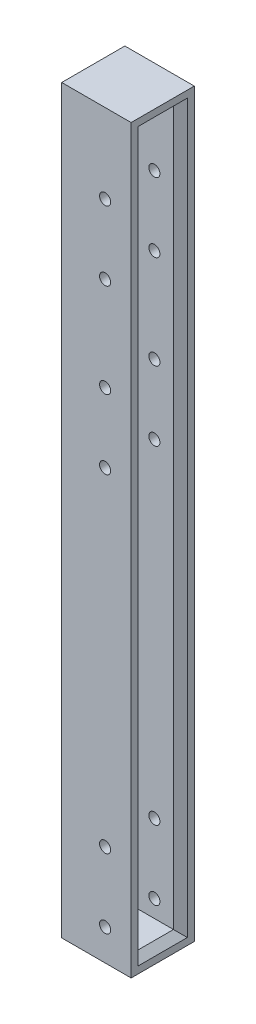
ISO-10303-21;
HEADER;
FILE_DESCRIPTION(('STEP AP214'),'2;1');
FILE_NAME('part.step','',(''),(''),'','','');
FILE_SCHEMA(('AUTOMOTIVE_DESIGN { 1 0 10303 214 1 1 1 1 }'));
ENDSEC;
DATA;
#1=APPLICATION_CONTEXT('core data for automotive mechanical design processes');
#2=APPLICATION_PROTOCOL_DEFINITION('international standard','automotive_design',2000,#1);
#3=PRODUCT_CONTEXT('',#1,'mechanical');
#4=PRODUCT('Part','Part','',(#3));
#5=PRODUCT_RELATED_PRODUCT_CATEGORY('part','',(#4));
#6=PRODUCT_DEFINITION_FORMATION('','',#4);
#7=PRODUCT_DEFINITION_CONTEXT('part definition',#1,'design');
#8=PRODUCT_DEFINITION('design','',#6,#7);
#9=PRODUCT_DEFINITION_SHAPE('','',#8);
#10=(LENGTH_UNIT() NAMED_UNIT(*) SI_UNIT(.MILLI.,.METRE.));
#11=(NAMED_UNIT(*) PLANE_ANGLE_UNIT() SI_UNIT($,.RADIAN.));
#12=(NAMED_UNIT(*) SI_UNIT($,.STERADIAN.) SOLID_ANGLE_UNIT());
#13=UNCERTAINTY_MEASURE_WITH_UNIT(LENGTH_MEASURE(1.E-05),#10,'distance_accuracy_value','');
#14=(GEOMETRIC_REPRESENTATION_CONTEXT(3) GLOBAL_UNCERTAINTY_ASSIGNED_CONTEXT((#13)) GLOBAL_UNIT_ASSIGNED_CONTEXT((#10,
#11,#12)) REPRESENTATION_CONTEXT('',''));
#15=CARTESIAN_POINT('',(0.,0.,0.));
#16=DIRECTION('',(0.,0.,1.));
#17=DIRECTION('',(1.,0.,0.));
#18=AXIS2_PLACEMENT_3D('',#15,#16,#17);
#19=CARTESIAN_POINT('',(-7.5,0.,0.));
#20=DIRECTION('',(-1.,0.,0.));
#21=DIRECTION('',(0.,0.,1.));
#22=AXIS2_PLACEMENT_3D('',#19,#20,#21);
#23=PLANE('',#22);
#24=CARTESIAN_POINT('',(-7.5,91.5,0.));
#25=DIRECTION('',(-1.,0.,0.));
#26=DIRECTION('',(0.,0.,1.));
#27=AXIS2_PLACEMENT_3D('',#24,#25,#26);
#28=CIRCLE('',#27,1.65);
#29=CARTESIAN_POINT('',(-7.5,91.5,1.64999999999995));
#30=VERTEX_POINT('',#29);
#31=EDGE_CURVE('E149',#30,#30,#28,.F.);
#32=ORIENTED_EDGE('',*,*,#31,.F.);
#33=EDGE_LOOP('',(#32));
#34=FACE_BOUND('',#33,.T.);
#35=CARTESIAN_POINT('',(-7.5,-74.,-0.200000000000019));
#36=DIRECTION('',(-1.,0.,0.));
#37=DIRECTION('',(0.,0.,1.));
#38=AXIS2_PLACEMENT_3D('',#35,#36,#37);
#39=CIRCLE('',#38,1.60000000000001);
#40=CARTESIAN_POINT('',(-7.5,-74.,1.39999999999999));
#41=VERTEX_POINT('',#40);
#42=EDGE_CURVE('E160',#41,#41,#39,.F.);
#43=ORIENTED_EDGE('',*,*,#42,.F.);
#44=EDGE_LOOP('',(#43));
#45=FACE_BOUND('',#44,.T.);
#46=CARTESIAN_POINT('',(-7.5,-34.,-0.200000000000042));
#47=DIRECTION('',(-1.,0.,0.));
#48=DIRECTION('',(0.,0.,1.));
#49=AXIS2_PLACEMENT_3D('',#46,#47,#48);
#50=CIRCLE('',#49,1.6);
#51=CARTESIAN_POINT('',(-7.5,-34.,1.39999999999995));
#52=VERTEX_POINT('',#51);
#53=EDGE_CURVE('E110',#52,#52,#50,.F.);
#54=ORIENTED_EDGE('',*,*,#53,.F.);
#55=EDGE_LOOP('',(#54));
#56=FACE_BOUND('',#55,.T.);
#57=DIRECTION('',(0.,0.,1.));
#58=VECTOR('',#57,1.);
#59=CARTESIAN_POINT('',(-7.5,-110.,0.));
#60=LINE('',#59,#58);
#61=CARTESIAN_POINT('',(-7.5,-110.,-5.1));
#62=VERTEX_POINT('',#61);
#63=CARTESIAN_POINT('',(-7.5,-110.,5.1));
#64=VERTEX_POINT('',#63);
#65=EDGE_CURVE('E172',#62,#64,#60,.T.);
#66=ORIENTED_EDGE('',*,*,#65,.F.);
#67=DIRECTION('',(0.,-1.,0.));
#68=VECTOR('',#67,1.);
#69=CARTESIAN_POINT('',(-7.5,0.,-5.1));
#70=LINE('',#69,#68);
#71=CARTESIAN_POINT('',(-7.5,95.5,-5.1));
#72=VERTEX_POINT('',#71);
#73=EDGE_CURVE('E163',#72,#62,#70,.T.);
#74=ORIENTED_EDGE('',*,*,#73,.F.);
#75=DIRECTION('',(0.,0.,1.));
#76=VECTOR('',#75,1.);
#77=CARTESIAN_POINT('',(-7.5,95.5,0.));
#78=LINE('',#77,#76);
#79=CARTESIAN_POINT('',(-7.5,95.5,5.1));
#80=VERTEX_POINT('',#79);
#81=EDGE_CURVE('E156',#72,#80,#78,.T.);
#82=ORIENTED_EDGE('',*,*,#81,.T.);
#83=DIRECTION('',(0.,1.,0.));
#84=VECTOR('',#83,1.);
#85=CARTESIAN_POINT('',(-7.5,0.,5.1));
#86=LINE('',#85,#84);
#87=EDGE_CURVE('E159',#64,#80,#86,.T.);
#88=ORIENTED_EDGE('',*,*,#87,.F.);
#89=EDGE_LOOP('',(#66,#74,#82,#88));
#90=FACE_BOUND('',#89,.T.);
#91=ADVANCED_FACE('F53',(#34,#45,#56,#90),#23,.F.);
#92=CARTESIAN_POINT('',(-12.5,99.5,0.));
#93=DIRECTION('',(0.,-1.,0.));
#94=DIRECTION('',(0.,0.,-1.));
#95=AXIS2_PLACEMENT_3D('',#92,#93,#94);
#96=PLANE('',#95);
#97=DIRECTION('',(0.,0.,-1.));
#98=VECTOR('',#97,1.);
#99=CARTESIAN_POINT('',(-12.5,99.5,0.));
#100=LINE('',#99,#98);
#101=CARTESIAN_POINT('',(-12.5,99.5,9.1));
#102=VERTEX_POINT('',#101);
#103=CARTESIAN_POINT('',(-12.5,99.5,-9.1));
#104=VERTEX_POINT('',#103);
#105=EDGE_CURVE('E148',#102,#104,#100,.T.);
#106=ORIENTED_EDGE('',*,*,#105,.F.);
#107=DIRECTION('',(-1.,0.,0.));
#108=VECTOR('',#107,1.);
#109=CARTESIAN_POINT('',(-12.5,99.5,9.1));
#110=LINE('',#109,#108);
#111=CARTESIAN_POINT('',(7.5,99.5,9.1));
#112=VERTEX_POINT('',#111);
#113=EDGE_CURVE('E111',#112,#102,#110,.T.);
#114=ORIENTED_EDGE('',*,*,#113,.F.);
#115=DIRECTION('',(0.,0.,1.));
#116=VECTOR('',#115,1.);
#117=CARTESIAN_POINT('',(7.5,99.5,0.));
#118=LINE('',#117,#116);
#119=CARTESIAN_POINT('',(7.5,99.5,-9.1));
#120=VERTEX_POINT('',#119);
#121=EDGE_CURVE('E124',#120,#112,#118,.T.);
#122=ORIENTED_EDGE('',*,*,#121,.F.);
#123=DIRECTION('',(-1.,0.,0.));
#124=VECTOR('',#123,1.);
#125=CARTESIAN_POINT('',(7.5,99.5,-9.1));
#126=LINE('',#125,#124);
#127=EDGE_CURVE('E135',#120,#104,#126,.T.);
#128=ORIENTED_EDGE('',*,*,#127,.T.);
#129=EDGE_LOOP('',(#106,#114,#122,#128));
#130=FACE_BOUND('',#129,.T.);
#131=ADVANCED_FACE('F371',(#130),#96,.F.);
#132=CARTESIAN_POINT('',(-12.5,-74.,-0.200000000000019));
#133=DIRECTION('',(1.,0.,0.));
#134=DIRECTION('',(0.,0.,-1.));
#135=AXIS2_PLACEMENT_3D('',#132,#133,#134);
#136=CYLINDRICAL_SURFACE('',#135,1.60000000000001);
#137=CARTESIAN_POINT('',(-12.5,-74.,-0.200000000000019));
#138=DIRECTION('',(-1.,0.,0.));
#139=DIRECTION('',(0.,0.,1.));
#140=AXIS2_PLACEMENT_3D('',#137,#138,#139);
#141=CIRCLE('',#140,1.60000000000001);
#142=CARTESIAN_POINT('',(-12.5,-74.,1.39999999999999));
#143=VERTEX_POINT('',#142);
#144=EDGE_CURVE('E150',#143,#143,#141,.F.);
#145=ORIENTED_EDGE('',*,*,#144,.F.);
#146=EDGE_LOOP('',(#145));
#147=FACE_BOUND('',#146,.T.);
#148=ORIENTED_EDGE('',*,*,#42,.T.);
#149=EDGE_LOOP('',(#148));
#150=FACE_BOUND('',#149,.T.);
#151=ADVANCED_FACE('F378',(#147,#150),#136,.F.);
#152=CARTESIAN_POINT('',(-12.5,-34.,-0.200000000000041));
#153=DIRECTION('',(1.,0.,0.));
#154=DIRECTION('',(0.,0.,-1.));
#155=AXIS2_PLACEMENT_3D('',#152,#153,#154);
#156=CYLINDRICAL_SURFACE('',#155,1.6);
#157=CARTESIAN_POINT('',(-12.5,-34.,-0.200000000000041));
#158=DIRECTION('',(-1.,0.,0.));
#159=DIRECTION('',(0.,0.,1.));
#160=AXIS2_PLACEMENT_3D('',#157,#158,#159);
#161=CIRCLE('',#160,1.6);
#162=CARTESIAN_POINT('',(-12.5,-34.,1.39999999999996));
#163=VERTEX_POINT('',#162);
#164=EDGE_CURVE('E145',#163,#163,#161,.F.);
#165=ORIENTED_EDGE('',*,*,#164,.F.);
#166=EDGE_LOOP('',(#165));
#167=FACE_BOUND('',#166,.T.);
#168=ORIENTED_EDGE('',*,*,#53,.T.);
#169=EDGE_LOOP('',(#168));
#170=FACE_BOUND('',#169,.T.);
#171=ADVANCED_FACE('F387',(#167,#170),#156,.F.);
#172=CARTESIAN_POINT('',(-12.5,91.5,0.));
#173=DIRECTION('',(1.,0.,0.));
#174=DIRECTION('',(0.,0.,-1.));
#175=AXIS2_PLACEMENT_3D('',#172,#173,#174);
#176=CYLINDRICAL_SURFACE('',#175,1.65);
#177=CARTESIAN_POINT('',(-12.5,91.5,0.));
#178=DIRECTION('',(-1.,0.,0.));
#179=DIRECTION('',(0.,0.,1.));
#180=AXIS2_PLACEMENT_3D('',#177,#178,#179);
#181=CIRCLE('',#180,1.65);
#182=CARTESIAN_POINT('',(-12.5,91.5,1.64999999999995));
#183=VERTEX_POINT('',#182);
#184=EDGE_CURVE('E153',#183,#183,#181,.F.);
#185=ORIENTED_EDGE('',*,*,#184,.F.);
#186=EDGE_LOOP('',(#185));
#187=FACE_BOUND('',#186,.T.);
#188=ORIENTED_EDGE('',*,*,#31,.T.);
#189=EDGE_LOOP('',(#188));
#190=FACE_BOUND('',#189,.T.);
#191=ADVANCED_FACE('F385',(#187,#190),#176,.F.);
#192=CARTESIAN_POINT('',(-12.5,0.,0.));
#193=DIRECTION('',(-1.,0.,0.));
#194=DIRECTION('',(0.,0.,1.));
#195=AXIS2_PLACEMENT_3D('',#192,#193,#194);
#196=PLANE('',#195);
#197=DIRECTION('',(0.,1.,0.));
#198=VECTOR('',#197,1.);
#199=CARTESIAN_POINT('',(-12.5,0.,9.1));
#200=LINE('',#199,#198);
#201=CARTESIAN_POINT('',(-12.5,-114.,9.1));
#202=VERTEX_POINT('',#201);
#203=EDGE_CURVE('E107',#202,#102,#200,.T.);
#204=ORIENTED_EDGE('',*,*,#203,.T.);
#205=ORIENTED_EDGE('',*,*,#105,.T.);
#206=DIRECTION('',(0.,-1.,0.));
#207=VECTOR('',#206,1.);
#208=CARTESIAN_POINT('',(-12.5,0.,-9.09999999999999));
#209=LINE('',#208,#207);
#210=CARTESIAN_POINT('',(-12.5,-114.,-9.09999999999997));
#211=VERTEX_POINT('',#210);
#212=EDGE_CURVE('E109',#104,#211,#209,.T.);
#213=ORIENTED_EDGE('',*,*,#212,.T.);
#214=DIRECTION('',(0.,0.,-1.));
#215=VECTOR('',#214,1.);
#216=CARTESIAN_POINT('',(-12.5,-114.,0.));
#217=LINE('',#216,#215);
#218=EDGE_CURVE('E57',#202,#211,#217,.T.);
#219=ORIENTED_EDGE('',*,*,#218,.F.);
#220=EDGE_LOOP('',(#204,#205,#213,#219));
#221=FACE_BOUND('',#220,.T.);
#222=ORIENTED_EDGE('',*,*,#164,.T.);
#223=EDGE_LOOP('',(#222));
#224=FACE_BOUND('',#223,.T.);
#225=ORIENTED_EDGE('',*,*,#144,.T.);
#226=EDGE_LOOP('',(#225));
#227=FACE_BOUND('',#226,.T.);
#228=ORIENTED_EDGE('',*,*,#184,.T.);
#229=EDGE_LOOP('',(#228));
#230=FACE_BOUND('',#229,.T.);
#231=ADVANCED_FACE('F104',(#221,#224,#227,#230),#196,.T.);
#232=CARTESIAN_POINT('',(0.,-114.,0.));
#233=DIRECTION('',(0.,-1.,0.));
#234=DIRECTION('',(0.,0.,-1.));
#235=AXIS2_PLACEMENT_3D('',#232,#233,#234);
#236=PLANE('',#235);
#237=DIRECTION('',(-1.,0.,0.));
#238=VECTOR('',#237,1.);
#239=CARTESIAN_POINT('',(0.,-114.,9.1));
#240=LINE('',#239,#238);
#241=CARTESIAN_POINT('',(7.5,-114.,9.1));
#242=VERTEX_POINT('',#241);
#243=EDGE_CURVE('E113',#242,#202,#240,.T.);
#244=ORIENTED_EDGE('',*,*,#243,.T.);
#245=ORIENTED_EDGE('',*,*,#218,.T.);
#246=DIRECTION('',(-1.,0.,0.));
#247=VECTOR('',#246,1.);
#248=CARTESIAN_POINT('',(7.5,-114.,-9.09999999999997));
#249=LINE('',#248,#247);
#250=CARTESIAN_POINT('',(7.5,-114.,-9.09999999999997));
#251=VERTEX_POINT('',#250);
#252=EDGE_CURVE('E119',#251,#211,#249,.T.);
#253=ORIENTED_EDGE('',*,*,#252,.F.);
#254=DIRECTION('',(0.,0.,1.));
#255=VECTOR('',#254,1.);
#256=CARTESIAN_POINT('',(7.5,-114.,0.));
#257=LINE('',#256,#255);
#258=EDGE_CURVE('E115',#251,#242,#257,.T.);
#259=ORIENTED_EDGE('',*,*,#258,.T.);
#260=EDGE_LOOP('',(#244,#245,#253,#259));
#261=FACE_BOUND('',#260,.T.);
#262=ADVANCED_FACE('F55',(#261),#236,.T.);
#263=CARTESIAN_POINT('',(7.5,-110.,0.));
#264=DIRECTION('',(0.,-1.,0.));
#265=DIRECTION('',(0.,0.,-1.));
#266=AXIS2_PLACEMENT_3D('',#263,#264,#265);
#267=PLANE('',#266);
#268=DIRECTION('',(-1.,0.,0.));
#269=VECTOR('',#268,1.);
#270=CARTESIAN_POINT('',(7.5,-110.,5.1));
#271=LINE('',#270,#269);
#272=CARTESIAN_POINT('',(5.50000000000003,-110.,5.1));
#273=VERTEX_POINT('',#272);
#274=EDGE_CURVE('E132',#273,#64,#271,.T.);
#275=ORIENTED_EDGE('',*,*,#274,.F.);
#276=DIRECTION('',(0.,0.,-1.));
#277=VECTOR('',#276,1.);
#278=CARTESIAN_POINT('',(5.50000000000003,-110.,0.));
#279=LINE('',#278,#277);
#280=CARTESIAN_POINT('',(5.50000000000003,-110.,-5.1));
#281=VERTEX_POINT('',#280);
#282=EDGE_CURVE('E187',#273,#281,#279,.T.);
#283=ORIENTED_EDGE('',*,*,#282,.T.);
#284=DIRECTION('',(-1.,0.,0.));
#285=VECTOR('',#284,1.);
#286=CARTESIAN_POINT('',(7.5,-110.,-5.1));
#287=LINE('',#286,#285);
#288=EDGE_CURVE('E141',#281,#62,#287,.T.);
#289=ORIENTED_EDGE('',*,*,#288,.T.);
#290=ORIENTED_EDGE('',*,*,#65,.T.);
#291=EDGE_LOOP('',(#275,#283,#289,#290));
#292=FACE_BOUND('',#291,.T.);
#293=ADVANCED_FACE('F320',(#292),#267,.F.);
#294=CARTESIAN_POINT('',(7.5,0.,5.1));
#295=DIRECTION('',(0.,0.,1.));
#296=DIRECTION('',(1.,0.,0.));
#297=AXIS2_PLACEMENT_3D('',#294,#295,#296);
#298=PLANE('',#297);
#299=CARTESIAN_POINT('',(0.,76.66,5.1));
#300=DIRECTION('',(0.,0.,1.));
#301=DIRECTION('',(1.,0.,0.));
#302=AXIS2_PLACEMENT_3D('',#299,#300,#301);
#303=CIRCLE('',#302,1.6);
#304=CARTESIAN_POINT('',(1.6,76.66,5.1));
#305=VERTEX_POINT('',#304);
#306=EDGE_CURVE('E198',#305,#305,#303,.T.);
#307=ORIENTED_EDGE('',*,*,#306,.T.);
#308=EDGE_LOOP('',(#307));
#309=FACE_BOUND('',#308,.T.);
#310=CARTESIAN_POINT('',(0.,-105.,5.1));
#311=DIRECTION('',(0.,0.,1.));
#312=DIRECTION('',(1.,0.,0.));
#313=AXIS2_PLACEMENT_3D('',#310,#311,#312);
#314=CIRCLE('',#313,1.60000000000001);
#315=CARTESIAN_POINT('',(1.60000000000001,-105.,5.1));
#316=VERTEX_POINT('',#315);
#317=EDGE_CURVE('E227',#316,#316,#314,.T.);
#318=ORIENTED_EDGE('',*,*,#317,.T.);
#319=EDGE_LOOP('',(#318));
#320=FACE_BOUND('',#319,.T.);
#321=CARTESIAN_POINT('',(0.,-85.,5.1));
#322=DIRECTION('',(0.,0.,1.));
#323=DIRECTION('',(1.,0.,0.));
#324=AXIS2_PLACEMENT_3D('',#321,#322,#323);
#325=CIRCLE('',#324,1.6);
#326=CARTESIAN_POINT('',(1.6,-85.,5.1));
#327=VERTEX_POINT('',#326);
#328=EDGE_CURVE('E236',#327,#327,#325,.T.);
#329=ORIENTED_EDGE('',*,*,#328,.T.);
#330=EDGE_LOOP('',(#329));
#331=FACE_BOUND('',#330,.T.);
#332=CARTESIAN_POINT('',(0.,9.60000000000003,5.1));
#333=DIRECTION('',(0.,0.,1.));
#334=DIRECTION('',(1.,0.,0.));
#335=AXIS2_PLACEMENT_3D('',#332,#333,#334);
#336=CIRCLE('',#335,1.6);
#337=CARTESIAN_POINT('',(1.6,9.60000000000003,5.1));
#338=VERTEX_POINT('',#337);
#339=EDGE_CURVE('E245',#338,#338,#336,.T.);
#340=ORIENTED_EDGE('',*,*,#339,.T.);
#341=EDGE_LOOP('',(#340));
#342=FACE_BOUND('',#341,.T.);
#343=CARTESIAN_POINT('',(0.,29.6,5.1));
#344=DIRECTION('',(0.,0.,1.));
#345=DIRECTION('',(1.,0.,0.));
#346=AXIS2_PLACEMENT_3D('',#343,#344,#345);
#347=CIRCLE('',#346,1.6);
#348=CARTESIAN_POINT('',(1.60000000000002,29.6,5.1));
#349=VERTEX_POINT('',#348);
#350=EDGE_CURVE('E254',#349,#349,#347,.T.);
#351=ORIENTED_EDGE('',*,*,#350,.T.);
#352=EDGE_LOOP('',(#351));
#353=FACE_BOUND('',#352,.T.);
#354=CARTESIAN_POINT('',(0.,56.66,5.1));
#355=DIRECTION('',(0.,0.,1.));
#356=DIRECTION('',(1.,0.,0.));
#357=AXIS2_PLACEMENT_3D('',#354,#355,#356);
#358=CIRCLE('',#357,1.6);
#359=CARTESIAN_POINT('',(1.6,56.66,5.1));
#360=VERTEX_POINT('',#359);
#361=EDGE_CURVE('E263',#360,#360,#358,.T.);
#362=ORIENTED_EDGE('',*,*,#361,.T.);
#363=EDGE_LOOP('',(#362));
#364=FACE_BOUND('',#363,.T.);
#365=DIRECTION('',(-1.,0.,0.));
#366=VECTOR('',#365,1.);
#367=CARTESIAN_POINT('',(7.5,95.5,5.1));
#368=LINE('',#367,#366);
#369=CARTESIAN_POINT('',(5.50000000000003,95.5,5.1));
#370=VERTEX_POINT('',#369);
#371=EDGE_CURVE('E136',#370,#80,#368,.T.);
#372=ORIENTED_EDGE('',*,*,#371,.F.);
#373=DIRECTION('',(0.,-1.,0.));
#374=VECTOR('',#373,1.);
#375=CARTESIAN_POINT('',(5.50000000000003,0.,5.1));
#376=LINE('',#375,#374);
#377=EDGE_CURVE('E190',#370,#273,#376,.T.);
#378=ORIENTED_EDGE('',*,*,#377,.T.);
#379=ORIENTED_EDGE('',*,*,#274,.T.);
#380=ORIENTED_EDGE('',*,*,#87,.T.);
#381=EDGE_LOOP('',(#372,#378,#379,#380));
#382=FACE_BOUND('',#381,.T.);
#383=ADVANCED_FACE('F332',(#309,#320,#331,#342,#353,#364,#382),#298,.F.);
#384=CARTESIAN_POINT('',(7.5,95.5,0.));
#385=DIRECTION('',(0.,-1.,0.));
#386=DIRECTION('',(0.,0.,-1.));
#387=AXIS2_PLACEMENT_3D('',#384,#385,#386);
#388=PLANE('',#387);
#389=DIRECTION('',(-1.,0.,0.));
#390=VECTOR('',#389,1.);
#391=CARTESIAN_POINT('',(7.5,95.5,-5.1));
#392=LINE('',#391,#390);
#393=CARTESIAN_POINT('',(5.50000000000003,95.5,-5.1));
#394=VERTEX_POINT('',#393);
#395=EDGE_CURVE('E139',#394,#72,#392,.T.);
#396=ORIENTED_EDGE('',*,*,#395,.F.);
#397=DIRECTION('',(0.,0.,1.));
#398=VECTOR('',#397,1.);
#399=CARTESIAN_POINT('',(5.50000000000003,95.5,5.1));
#400=LINE('',#399,#398);
#401=EDGE_CURVE('E12',#394,#370,#400,.T.);
#402=ORIENTED_EDGE('',*,*,#401,.T.);
#403=ORIENTED_EDGE('',*,*,#371,.T.);
#404=ORIENTED_EDGE('',*,*,#81,.F.);
#405=EDGE_LOOP('',(#396,#402,#403,#404));
#406=FACE_BOUND('',#405,.T.);
#407=ADVANCED_FACE('F310',(#406),#388,.T.);
#408=CARTESIAN_POINT('',(7.5,0.,-5.1));
#409=DIRECTION('',(0.,0.,-1.));
#410=DIRECTION('',(-1.,0.,0.));
#411=AXIS2_PLACEMENT_3D('',#408,#409,#410);
#412=PLANE('',#411);
#413=CARTESIAN_POINT('',(0.,76.66,-5.1));
#414=DIRECTION('',(0.,0.,-1.));
#415=DIRECTION('',(-1.,0.,0.));
#416=AXIS2_PLACEMENT_3D('',#413,#414,#415);
#417=CIRCLE('',#416,1.6);
#418=CARTESIAN_POINT('',(-1.6,76.66,-5.1));
#419=VERTEX_POINT('',#418);
#420=EDGE_CURVE('E221',#419,#419,#417,.T.);
#421=ORIENTED_EDGE('',*,*,#420,.T.);
#422=EDGE_LOOP('',(#421));
#423=FACE_BOUND('',#422,.T.);
#424=CARTESIAN_POINT('',(0.,-105.,-5.1));
#425=DIRECTION('',(0.,0.,-1.));
#426=DIRECTION('',(-1.,0.,0.));
#427=AXIS2_PLACEMENT_3D('',#424,#425,#426);
#428=CIRCLE('',#427,1.60000000000001);
#429=CARTESIAN_POINT('',(-1.60000000000001,-105.,-5.1));
#430=VERTEX_POINT('',#429);
#431=EDGE_CURVE('E230',#430,#430,#428,.T.);
#432=ORIENTED_EDGE('',*,*,#431,.T.);
#433=EDGE_LOOP('',(#432));
#434=FACE_BOUND('',#433,.T.);
#435=CARTESIAN_POINT('',(0.,-85.,-5.1));
#436=DIRECTION('',(0.,0.,-1.));
#437=DIRECTION('',(-1.,0.,0.));
#438=AXIS2_PLACEMENT_3D('',#435,#436,#437);
#439=CIRCLE('',#438,1.6);
#440=CARTESIAN_POINT('',(-1.6,-85.,-5.1));
#441=VERTEX_POINT('',#440);
#442=EDGE_CURVE('E239',#441,#441,#439,.T.);
#443=ORIENTED_EDGE('',*,*,#442,.T.);
#444=EDGE_LOOP('',(#443));
#445=FACE_BOUND('',#444,.T.);
#446=CARTESIAN_POINT('',(0.,9.60000000000003,-5.1));
#447=DIRECTION('',(0.,0.,-1.));
#448=DIRECTION('',(-1.,0.,0.));
#449=AXIS2_PLACEMENT_3D('',#446,#447,#448);
#450=CIRCLE('',#449,1.6);
#451=CARTESIAN_POINT('',(-1.6,9.60000000000003,-5.1));
#452=VERTEX_POINT('',#451);
#453=EDGE_CURVE('E248',#452,#452,#450,.T.);
#454=ORIENTED_EDGE('',*,*,#453,.T.);
#455=EDGE_LOOP('',(#454));
#456=FACE_BOUND('',#455,.T.);
#457=CARTESIAN_POINT('',(0.,29.6,-5.1));
#458=DIRECTION('',(0.,0.,-1.));
#459=DIRECTION('',(-1.,0.,0.));
#460=AXIS2_PLACEMENT_3D('',#457,#458,#459);
#461=CIRCLE('',#460,1.6);
#462=CARTESIAN_POINT('',(-1.59999999999999,29.6,-5.1));
#463=VERTEX_POINT('',#462);
#464=EDGE_CURVE('E257',#463,#463,#461,.T.);
#465=ORIENTED_EDGE('',*,*,#464,.T.);
#466=EDGE_LOOP('',(#465));
#467=FACE_BOUND('',#466,.T.);
#468=CARTESIAN_POINT('',(0.,56.66,-5.1));
#469=DIRECTION('',(0.,0.,-1.));
#470=DIRECTION('',(-1.,0.,0.));
#471=AXIS2_PLACEMENT_3D('',#468,#469,#470);
#472=CIRCLE('',#471,1.6);
#473=CARTESIAN_POINT('',(-1.6,56.66,-5.1));
#474=VERTEX_POINT('',#473);
#475=EDGE_CURVE('E266',#474,#474,#472,.T.);
#476=ORIENTED_EDGE('',*,*,#475,.T.);
#477=EDGE_LOOP('',(#476));
#478=FACE_BOUND('',#477,.T.);
#479=ORIENTED_EDGE('',*,*,#288,.F.);
#480=DIRECTION('',(0.,1.,0.));
#481=VECTOR('',#480,1.);
#482=CARTESIAN_POINT('',(5.50000000000003,0.,-5.1));
#483=LINE('',#482,#481);
#484=EDGE_CURVE('E63',#281,#394,#483,.T.);
#485=ORIENTED_EDGE('',*,*,#484,.T.);
#486=ORIENTED_EDGE('',*,*,#395,.T.);
#487=ORIENTED_EDGE('',*,*,#73,.T.);
#488=EDGE_LOOP('',(#479,#485,#486,#487));
#489=FACE_BOUND('',#488,.T.);
#490=ADVANCED_FACE('F308',(#423,#434,#445,#456,#467,#478,#489),#412,.F.);
#491=CARTESIAN_POINT('',(7.5,0.,9.1));
#492=DIRECTION('',(0.,0.,1.));
#493=DIRECTION('',(1.,0.,0.));
#494=AXIS2_PLACEMENT_3D('',#491,#492,#493);
#495=PLANE('',#494);
#496=CARTESIAN_POINT('',(0.,76.66,9.1));
#497=DIRECTION('',(0.,0.,1.));
#498=DIRECTION('',(1.,0.,0.));
#499=AXIS2_PLACEMENT_3D('',#496,#497,#498);
#500=CIRCLE('',#499,1.6);
#501=CARTESIAN_POINT('',(1.6,76.66,9.1));
#502=VERTEX_POINT('',#501);
#503=EDGE_CURVE('E224',#502,#502,#500,.T.);
#504=ORIENTED_EDGE('',*,*,#503,.F.);
#505=EDGE_LOOP('',(#504));
#506=FACE_BOUND('',#505,.T.);
#507=CARTESIAN_POINT('',(0.,-105.,9.1));
#508=DIRECTION('',(0.,0.,1.));
#509=DIRECTION('',(1.,0.,0.));
#510=AXIS2_PLACEMENT_3D('',#507,#508,#509);
#511=CIRCLE('',#510,1.60000000000001);
#512=CARTESIAN_POINT('',(1.60000000000001,-105.,9.1));
#513=VERTEX_POINT('',#512);
#514=EDGE_CURVE('E233',#513,#513,#511,.T.);
#515=ORIENTED_EDGE('',*,*,#514,.F.);
#516=EDGE_LOOP('',(#515));
#517=FACE_BOUND('',#516,.T.);
#518=CARTESIAN_POINT('',(0.,-85.,9.1));
#519=DIRECTION('',(0.,0.,1.));
#520=DIRECTION('',(1.,0.,0.));
#521=AXIS2_PLACEMENT_3D('',#518,#519,#520);
#522=CIRCLE('',#521,1.6);
#523=CARTESIAN_POINT('',(1.6,-85.,9.1));
#524=VERTEX_POINT('',#523);
#525=EDGE_CURVE('E242',#524,#524,#522,.T.);
#526=ORIENTED_EDGE('',*,*,#525,.F.);
#527=EDGE_LOOP('',(#526));
#528=FACE_BOUND('',#527,.T.);
#529=CARTESIAN_POINT('',(0.,9.60000000000003,9.1));
#530=DIRECTION('',(0.,0.,1.));
#531=DIRECTION('',(1.,0.,0.));
#532=AXIS2_PLACEMENT_3D('',#529,#530,#531);
#533=CIRCLE('',#532,1.6);
#534=CARTESIAN_POINT('',(1.6,9.60000000000003,9.1));
#535=VERTEX_POINT('',#534);
#536=EDGE_CURVE('E251',#535,#535,#533,.T.);
#537=ORIENTED_EDGE('',*,*,#536,.F.);
#538=EDGE_LOOP('',(#537));
#539=FACE_BOUND('',#538,.T.);
#540=CARTESIAN_POINT('',(0.,29.6,9.1));
#541=DIRECTION('',(0.,0.,1.));
#542=DIRECTION('',(1.,0.,0.));
#543=AXIS2_PLACEMENT_3D('',#540,#541,#542);
#544=CIRCLE('',#543,1.6);
#545=CARTESIAN_POINT('',(1.60000000000002,29.6,9.1));
#546=VERTEX_POINT('',#545);
#547=EDGE_CURVE('E260',#546,#546,#544,.T.);
#548=ORIENTED_EDGE('',*,*,#547,.F.);
#549=EDGE_LOOP('',(#548));
#550=FACE_BOUND('',#549,.T.);
#551=CARTESIAN_POINT('',(0.,56.66,9.1));
#552=DIRECTION('',(0.,0.,1.));
#553=DIRECTION('',(1.,0.,0.));
#554=AXIS2_PLACEMENT_3D('',#551,#552,#553);
#555=CIRCLE('',#554,1.6);
#556=CARTESIAN_POINT('',(1.6,56.66,9.1));
#557=VERTEX_POINT('',#556);
#558=EDGE_CURVE('E269',#557,#557,#555,.T.);
#559=ORIENTED_EDGE('',*,*,#558,.F.);
#560=EDGE_LOOP('',(#559));
#561=FACE_BOUND('',#560,.T.);
#562=ORIENTED_EDGE('',*,*,#203,.F.);
#563=ORIENTED_EDGE('',*,*,#243,.F.);
#564=DIRECTION('',(0.,1.,0.));
#565=VECTOR('',#564,1.);
#566=CARTESIAN_POINT('',(7.5,0.,9.1));
#567=LINE('',#566,#565);
#568=EDGE_CURVE('E144',#242,#112,#567,.T.);
#569=ORIENTED_EDGE('',*,*,#568,.T.);
#570=ORIENTED_EDGE('',*,*,#113,.T.);
#571=EDGE_LOOP('',(#562,#563,#569,#570));
#572=FACE_BOUND('',#571,.T.);
#573=ADVANCED_FACE('F122',(#506,#517,#528,#539,#550,#561,#572),#495,.T.);
#574=CARTESIAN_POINT('',(7.5,0.,-9.09999999999999));
#575=DIRECTION('',(0.,0.,-1.));
#576=DIRECTION('',(0.,1.,0.));
#577=AXIS2_PLACEMENT_3D('',#574,#575,#576);
#578=PLANE('',#577);
#579=CARTESIAN_POINT('',(0.,76.66,-9.1));
#580=DIRECTION('',(0.,0.,-1.));
#581=DIRECTION('',(0.,1.,0.));
#582=AXIS2_PLACEMENT_3D('',#579,#580,#581);
#583=CIRCLE('',#582,1.6);
#584=CARTESIAN_POINT('',(0.,78.26,-9.1));
#585=VERTEX_POINT('',#584);
#586=EDGE_CURVE('E276',#585,#585,#583,.T.);
#587=ORIENTED_EDGE('',*,*,#586,.F.);
#588=EDGE_LOOP('',(#587));
#589=FACE_BOUND('',#588,.T.);
#590=CARTESIAN_POINT('',(0.,-105.,-9.09999999999998));
#591=DIRECTION('',(0.,0.,-1.));
#592=DIRECTION('',(0.,1.,0.));
#593=AXIS2_PLACEMENT_3D('',#590,#591,#592);
#594=CIRCLE('',#593,1.60000000000001);
#595=CARTESIAN_POINT('',(0.,-103.4,-9.09999999999998));
#596=VERTEX_POINT('',#595);
#597=EDGE_CURVE('E279',#596,#596,#594,.T.);
#598=ORIENTED_EDGE('',*,*,#597,.F.);
#599=EDGE_LOOP('',(#598));
#600=FACE_BOUND('',#599,.T.);
#601=CARTESIAN_POINT('',(0.,-85.,-9.09999999999998));
#602=DIRECTION('',(0.,0.,-1.));
#603=DIRECTION('',(0.,1.,0.));
#604=AXIS2_PLACEMENT_3D('',#601,#602,#603);
#605=CIRCLE('',#604,1.6);
#606=CARTESIAN_POINT('',(0.,-83.4,-9.09999999999998));
#607=VERTEX_POINT('',#606);
#608=EDGE_CURVE('E282',#607,#607,#605,.T.);
#609=ORIENTED_EDGE('',*,*,#608,.F.);
#610=EDGE_LOOP('',(#609));
#611=FACE_BOUND('',#610,.T.);
#612=CARTESIAN_POINT('',(0.,9.60000000000003,-9.09999999999999));
#613=DIRECTION('',(0.,0.,-1.));
#614=DIRECTION('',(0.,1.,0.));
#615=AXIS2_PLACEMENT_3D('',#612,#613,#614);
#616=CIRCLE('',#615,1.6);
#617=CARTESIAN_POINT('',(0.,11.2,-9.09999999999999));
#618=VERTEX_POINT('',#617);
#619=EDGE_CURVE('E285',#618,#618,#616,.T.);
#620=ORIENTED_EDGE('',*,*,#619,.F.);
#621=EDGE_LOOP('',(#620));
#622=FACE_BOUND('',#621,.T.);
#623=CARTESIAN_POINT('',(0.,29.6,-9.09999999999999));
#624=DIRECTION('',(0.,0.,-1.));
#625=DIRECTION('',(0.,1.,0.));
#626=AXIS2_PLACEMENT_3D('',#623,#624,#625);
#627=CIRCLE('',#626,1.6);
#628=CARTESIAN_POINT('',(0.,31.2,-9.09999999999999));
#629=VERTEX_POINT('',#628);
#630=EDGE_CURVE('E275',#629,#629,#627,.T.);
#631=ORIENTED_EDGE('',*,*,#630,.F.);
#632=EDGE_LOOP('',(#631));
#633=FACE_BOUND('',#632,.T.);
#634=CARTESIAN_POINT('',(0.,56.66,-9.1));
#635=DIRECTION('',(0.,0.,-1.));
#636=DIRECTION('',(0.,1.,0.));
#637=AXIS2_PLACEMENT_3D('',#634,#635,#636);
#638=CIRCLE('',#637,1.6);
#639=CARTESIAN_POINT('',(0.,58.26,-9.1));
#640=VERTEX_POINT('',#639);
#641=EDGE_CURVE('E272',#640,#640,#638,.T.);
#642=ORIENTED_EDGE('',*,*,#641,.F.);
#643=EDGE_LOOP('',(#642));
#644=FACE_BOUND('',#643,.T.);
#645=ORIENTED_EDGE('',*,*,#212,.F.);
#646=ORIENTED_EDGE('',*,*,#127,.F.);
#647=DIRECTION('',(0.,-1.,0.));
#648=VECTOR('',#647,1.);
#649=CARTESIAN_POINT('',(7.5,0.,-9.09999999999999));
#650=LINE('',#649,#648);
#651=EDGE_CURVE('E126',#120,#251,#650,.T.);
#652=ORIENTED_EDGE('',*,*,#651,.T.);
#653=ORIENTED_EDGE('',*,*,#252,.T.);
#654=EDGE_LOOP('',(#645,#646,#652,#653));
#655=FACE_BOUND('',#654,.T.);
#656=ADVANCED_FACE('F212',(#589,#600,#611,#622,#633,#644,#655),#578,.T.);
#657=CARTESIAN_POINT('',(7.5,0.,0.));
#658=DIRECTION('',(-1.,0.,0.));
#659=DIRECTION('',(0.,0.,1.));
#660=AXIS2_PLACEMENT_3D('',#657,#658,#659);
#661=PLANE('',#660);
#662=DIRECTION('',(0.,-1.,0.));
#663=VECTOR('',#662,1.);
#664=CARTESIAN_POINT('',(7.5,0.,-7.1));
#665=LINE('',#664,#663);
#666=CARTESIAN_POINT('',(7.5,97.5,-7.1));
#667=VERTEX_POINT('',#666);
#668=CARTESIAN_POINT('',(7.5,-112.,-7.1));
#669=VERTEX_POINT('',#668);
#670=EDGE_CURVE('E178',#667,#669,#665,.T.);
#671=ORIENTED_EDGE('',*,*,#670,.T.);
#672=DIRECTION('',(0.,0.,1.));
#673=VECTOR('',#672,1.);
#674=CARTESIAN_POINT('',(7.5,-112.,0.));
#675=LINE('',#674,#673);
#676=CARTESIAN_POINT('',(7.5,-112.,7.1));
#677=VERTEX_POINT('',#676);
#678=EDGE_CURVE('E184',#669,#677,#675,.T.);
#679=ORIENTED_EDGE('',*,*,#678,.T.);
#680=DIRECTION('',(0.,1.,0.));
#681=VECTOR('',#680,1.);
#682=CARTESIAN_POINT('',(7.5,0.,7.1));
#683=LINE('',#682,#681);
#684=CARTESIAN_POINT('',(7.5,97.5,7.1));
#685=VERTEX_POINT('',#684);
#686=EDGE_CURVE('E181',#677,#685,#683,.T.);
#687=ORIENTED_EDGE('',*,*,#686,.T.);
#688=DIRECTION('',(0.,0.,-1.));
#689=VECTOR('',#688,1.);
#690=CARTESIAN_POINT('',(7.5,97.5,-5.1));
#691=LINE('',#690,#689);
#692=EDGE_CURVE('E175',#685,#667,#691,.T.);
#693=ORIENTED_EDGE('',*,*,#692,.T.);
#694=EDGE_LOOP('',(#671,#679,#687,#693));
#695=FACE_BOUND('',#694,.T.);
#696=ORIENTED_EDGE('',*,*,#121,.T.);
#697=ORIENTED_EDGE('',*,*,#568,.F.);
#698=ORIENTED_EDGE('',*,*,#258,.F.);
#699=ORIENTED_EDGE('',*,*,#651,.F.);
#700=EDGE_LOOP('',(#696,#697,#698,#699));
#701=FACE_BOUND('',#700,.T.);
#702=ADVANCED_FACE('F215',(#695,#701),#661,.F.);
#703=CARTESIAN_POINT('',(5.50000000000003,95.5,0.));
#704=DIRECTION('',(0.707106781186552,-0.707106781186543,0.));
#705=DIRECTION('',(0.,0.,-1.));
#706=AXIS2_PLACEMENT_3D('',#703,#704,#705);
#707=PLANE('',#706);
#708=DIRECTION('',(0.577350269189621,0.577350269189629,0.577350269189628));
#709=VECTOR('',#708,1.);
#710=CARTESIAN_POINT('',(-24.9999999999999,64.9999999999997,-25.4000000000003));
#711=LINE('',#710,#709);
#712=EDGE_CURVE('E201',#370,#685,#711,.T.);
#713=ORIENTED_EDGE('',*,*,#712,.F.);
#714=ORIENTED_EDGE('',*,*,#401,.F.);
#715=DIRECTION('',(-0.57735026918962,-0.577350269189628,0.577350269189629));
#716=VECTOR('',#715,1.);
#717=CARTESIAN_POINT('',(-24.9999999999998,64.9999999999997,25.4000000000003));
#718=LINE('',#717,#716);
#719=EDGE_CURVE('E128',#667,#394,#718,.T.);
#720=ORIENTED_EDGE('',*,*,#719,.F.);
#721=ORIENTED_EDGE('',*,*,#692,.F.);
#722=EDGE_LOOP('',(#713,#714,#720,#721));
#723=FACE_BOUND('',#722,.T.);
#724=ADVANCED_FACE('F360',(#723),#707,.T.);
#725=CARTESIAN_POINT('',(7.5,0.,-7.1));
#726=DIRECTION('',(-0.707106781186553,0.,-0.707106781186542));
#727=DIRECTION('',(0.,-1.,0.));
#728=AXIS2_PLACEMENT_3D('',#725,#726,#727);
#729=PLANE('',#728);
#730=ORIENTED_EDGE('',*,*,#719,.T.);
#731=ORIENTED_EDGE('',*,*,#484,.F.);
#732=DIRECTION('',(0.57735026918962,-0.577350269189628,-0.577350269189629));
#733=VECTOR('',#732,1.);
#734=CARTESIAN_POINT('',(5.13333333333334,-109.633333333333,-4.73333333333331));
#735=LINE('',#734,#733);
#736=EDGE_CURVE('E197',#669,#281,#735,.F.);
#737=ORIENTED_EDGE('',*,*,#736,.F.);
#738=ORIENTED_EDGE('',*,*,#670,.F.);
#739=EDGE_LOOP('',(#730,#731,#737,#738));
#740=FACE_BOUND('',#739,.T.);
#741=ADVANCED_FACE('F357',(#740),#729,.F.);
#742=CARTESIAN_POINT('',(7.5,0.,7.1));
#743=DIRECTION('',(-0.707106781186552,0.,0.707106781186543));
#744=DIRECTION('',(0.,1.,0.));
#745=AXIS2_PLACEMENT_3D('',#742,#743,#744);
#746=PLANE('',#745);
#747=ORIENTED_EDGE('',*,*,#712,.T.);
#748=ORIENTED_EDGE('',*,*,#686,.F.);
#749=DIRECTION('',(-0.577350269189621,0.577350269189629,-0.577350269189628));
#750=VECTOR('',#749,1.);
#751=CARTESIAN_POINT('',(5.13333333333334,-109.633333333333,4.73333333333331));
#752=LINE('',#751,#750);
#753=EDGE_CURVE('E194',#273,#677,#752,.F.);
#754=ORIENTED_EDGE('',*,*,#753,.F.);
#755=ORIENTED_EDGE('',*,*,#377,.F.);
#756=EDGE_LOOP('',(#747,#748,#754,#755));
#757=FACE_BOUND('',#756,.T.);
#758=ADVANCED_FACE('F351',(#757),#746,.F.);
#759=CARTESIAN_POINT('',(7.5,-112.,0.));
#760=DIRECTION('',(-0.707106781186552,-0.707106781186543,0.));
#761=DIRECTION('',(0.,0.,1.));
#762=AXIS2_PLACEMENT_3D('',#759,#760,#761);
#763=PLANE('',#762);
#764=ORIENTED_EDGE('',*,*,#736,.T.);
#765=ORIENTED_EDGE('',*,*,#282,.F.);
#766=ORIENTED_EDGE('',*,*,#753,.T.);
#767=ORIENTED_EDGE('',*,*,#678,.F.);
#768=EDGE_LOOP('',(#764,#765,#766,#767));
#769=FACE_BOUND('',#768,.T.);
#770=ADVANCED_FACE('F303',(#769),#763,.F.);
#771=CARTESIAN_POINT('',(0.,56.66,10.9));
#772=DIRECTION('',(0.,0.,-1.));
#773=DIRECTION('',(0.,1.,0.));
#774=AXIS2_PLACEMENT_3D('',#771,#772,#773);
#775=CYLINDRICAL_SURFACE('',#774,1.6);
#776=ORIENTED_EDGE('',*,*,#641,.T.);
#777=EDGE_LOOP('',(#776));
#778=FACE_BOUND('',#777,.T.);
#779=ORIENTED_EDGE('',*,*,#475,.F.);
#780=EDGE_LOOP('',(#779));
#781=FACE_BOUND('',#780,.T.);
#782=ADVANCED_FACE('F300',(#778,#781),#775,.F.);
#783=CARTESIAN_POINT('',(0.,29.6,10.9));
#784=DIRECTION('',(0.,0.,-1.));
#785=DIRECTION('',(0.,1.,0.));
#786=AXIS2_PLACEMENT_3D('',#783,#784,#785);
#787=CYLINDRICAL_SURFACE('',#786,1.6);
#788=ORIENTED_EDGE('',*,*,#630,.T.);
#789=EDGE_LOOP('',(#788));
#790=FACE_BOUND('',#789,.T.);
#791=ORIENTED_EDGE('',*,*,#464,.F.);
#792=EDGE_LOOP('',(#791));
#793=FACE_BOUND('',#792,.T.);
#794=ADVANCED_FACE('F291',(#790,#793),#787,.F.);
#795=CARTESIAN_POINT('',(0.,9.60000000000003,10.9));
#796=DIRECTION('',(0.,0.,-1.));
#797=DIRECTION('',(0.,1.,0.));
#798=AXIS2_PLACEMENT_3D('',#795,#796,#797);
#799=CYLINDRICAL_SURFACE('',#798,1.6);
#800=ORIENTED_EDGE('',*,*,#619,.T.);
#801=EDGE_LOOP('',(#800));
#802=FACE_BOUND('',#801,.T.);
#803=ORIENTED_EDGE('',*,*,#453,.F.);
#804=EDGE_LOOP('',(#803));
#805=FACE_BOUND('',#804,.T.);
#806=ADVANCED_FACE('F484',(#802,#805),#799,.F.);
#807=CARTESIAN_POINT('',(0.,-85.,10.9));
#808=DIRECTION('',(0.,0.,-1.));
#809=DIRECTION('',(0.,1.,0.));
#810=AXIS2_PLACEMENT_3D('',#807,#808,#809);
#811=CYLINDRICAL_SURFACE('',#810,1.6);
#812=ORIENTED_EDGE('',*,*,#608,.T.);
#813=EDGE_LOOP('',(#812));
#814=FACE_BOUND('',#813,.T.);
#815=ORIENTED_EDGE('',*,*,#442,.F.);
#816=EDGE_LOOP('',(#815));
#817=FACE_BOUND('',#816,.T.);
#818=ADVANCED_FACE('F457',(#814,#817),#811,.F.);
#819=CARTESIAN_POINT('',(0.,-105.,10.9));
#820=DIRECTION('',(0.,0.,-1.));
#821=DIRECTION('',(0.,1.,0.));
#822=AXIS2_PLACEMENT_3D('',#819,#820,#821);
#823=CYLINDRICAL_SURFACE('',#822,1.60000000000001);
#824=ORIENTED_EDGE('',*,*,#597,.T.);
#825=EDGE_LOOP('',(#824));
#826=FACE_BOUND('',#825,.T.);
#827=ORIENTED_EDGE('',*,*,#431,.F.);
#828=EDGE_LOOP('',(#827));
#829=FACE_BOUND('',#828,.T.);
#830=ADVANCED_FACE('F451',(#826,#829),#823,.F.);
#831=CARTESIAN_POINT('',(0.,76.66,10.9));
#832=DIRECTION('',(0.,0.,-1.));
#833=DIRECTION('',(0.,1.,0.));
#834=AXIS2_PLACEMENT_3D('',#831,#832,#833);
#835=CYLINDRICAL_SURFACE('',#834,1.6);
#836=ORIENTED_EDGE('',*,*,#586,.T.);
#837=EDGE_LOOP('',(#836));
#838=FACE_BOUND('',#837,.T.);
#839=ORIENTED_EDGE('',*,*,#420,.F.);
#840=EDGE_LOOP('',(#839));
#841=FACE_BOUND('',#840,.T.);
#842=ADVANCED_FACE('F441',(#838,#841),#835,.F.);
#843=ORIENTED_EDGE('',*,*,#558,.T.);
#844=EDGE_LOOP('',(#843));
#845=FACE_BOUND('',#844,.T.);
#846=ORIENTED_EDGE('',*,*,#361,.F.);
#847=EDGE_LOOP('',(#846));
#848=FACE_BOUND('',#847,.T.);
#849=ADVANCED_FACE('F305',(#845,#848),#775,.F.);
#850=ORIENTED_EDGE('',*,*,#547,.T.);
#851=EDGE_LOOP('',(#850));
#852=FACE_BOUND('',#851,.T.);
#853=ORIENTED_EDGE('',*,*,#350,.F.);
#854=EDGE_LOOP('',(#853));
#855=FACE_BOUND('',#854,.T.);
#856=ADVANCED_FACE('F440',(#852,#855),#787,.F.);
#857=ORIENTED_EDGE('',*,*,#536,.T.);
#858=EDGE_LOOP('',(#857));
#859=FACE_BOUND('',#858,.T.);
#860=ORIENTED_EDGE('',*,*,#339,.F.);
#861=EDGE_LOOP('',(#860));
#862=FACE_BOUND('',#861,.T.);
#863=ADVANCED_FACE('F448',(#859,#862),#799,.F.);
#864=ORIENTED_EDGE('',*,*,#525,.T.);
#865=EDGE_LOOP('',(#864));
#866=FACE_BOUND('',#865,.T.);
#867=ORIENTED_EDGE('',*,*,#328,.F.);
#868=EDGE_LOOP('',(#867));
#869=FACE_BOUND('',#868,.T.);
#870=ADVANCED_FACE('F467',(#866,#869),#811,.F.);
#871=ORIENTED_EDGE('',*,*,#514,.T.);
#872=EDGE_LOOP('',(#871));
#873=FACE_BOUND('',#872,.T.);
#874=ORIENTED_EDGE('',*,*,#317,.F.);
#875=EDGE_LOOP('',(#874));
#876=FACE_BOUND('',#875,.T.);
#877=ADVANCED_FACE('F460',(#873,#876),#823,.F.);
#878=ORIENTED_EDGE('',*,*,#503,.T.);
#879=EDGE_LOOP('',(#878));
#880=FACE_BOUND('',#879,.T.);
#881=ORIENTED_EDGE('',*,*,#306,.F.);
#882=EDGE_LOOP('',(#881));
#883=FACE_BOUND('',#882,.T.);
#884=ADVANCED_FACE('F453',(#880,#883),#835,.F.);
#885=CLOSED_SHELL('',(#91,#131,#151,#171,#191,#231,#262,#293,#383,#407,#490,#573,#656,#702,#724,
#741,#758,#770,#782,#794,#806,#818,#830,#842,#849,#856,#863,#870,#877,#884));
#886=MANIFOLD_SOLID_BREP('B2',#885);
#887=ADVANCED_BREP_SHAPE_REPRESENTATION('',(#18,#886),#14);
#888=SHAPE_DEFINITION_REPRESENTATION(#9,#887);
ENDSEC;
END-ISO-10303-21;
